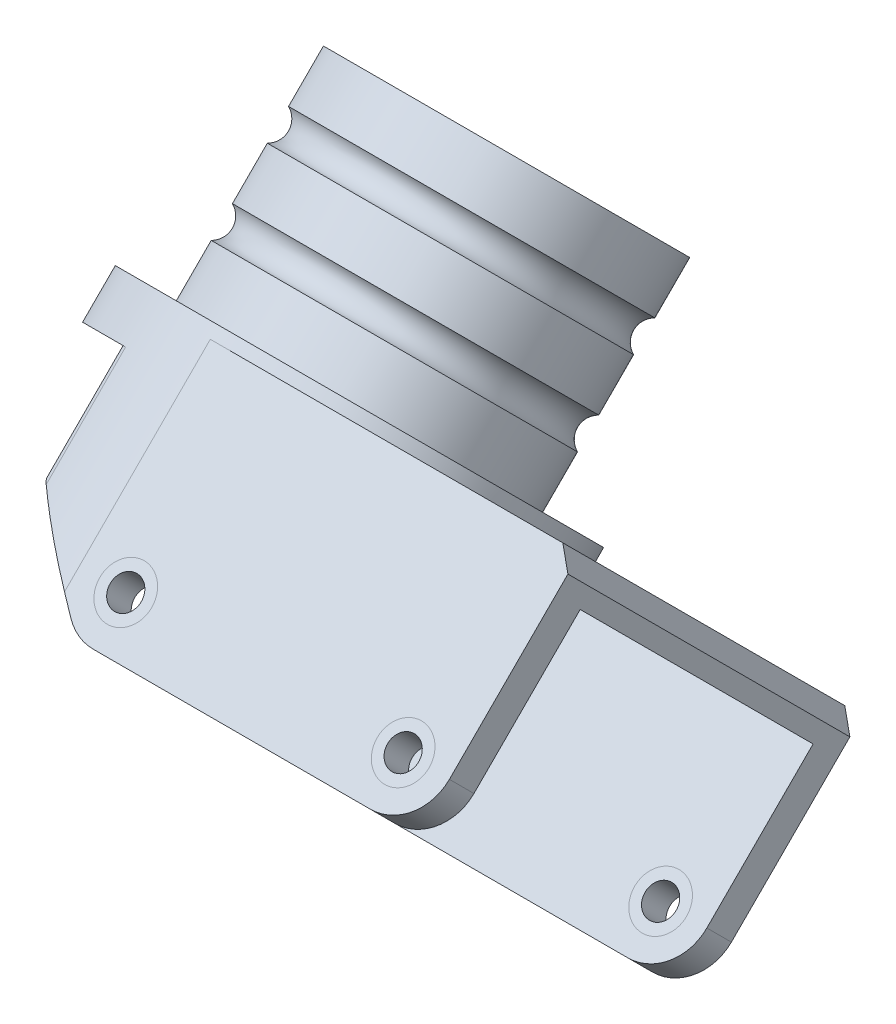
ISO-10303-21;
HEADER;
FILE_DESCRIPTION(('STEP AP214'),'2;1');
FILE_NAME('part.step','',(''),(''),'','','');
FILE_SCHEMA(('AUTOMOTIVE_DESIGN { 1 0 10303 214 1 1 1 1 }'));
ENDSEC;
DATA;
#1=APPLICATION_CONTEXT('core data for automotive mechanical design processes');
#2=APPLICATION_PROTOCOL_DEFINITION('international standard','automotive_design',2000,#1);
#3=PRODUCT_CONTEXT('',#1,'mechanical');
#4=PRODUCT('Part','Part','',(#3));
#5=PRODUCT_RELATED_PRODUCT_CATEGORY('part','',(#4));
#6=PRODUCT_DEFINITION_FORMATION('','',#4);
#7=PRODUCT_DEFINITION_CONTEXT('part definition',#1,'design');
#8=PRODUCT_DEFINITION('design','',#6,#7);
#9=PRODUCT_DEFINITION_SHAPE('','',#8);
#10=(LENGTH_UNIT() NAMED_UNIT(*) SI_UNIT(.MILLI.,.METRE.));
#11=(NAMED_UNIT(*) PLANE_ANGLE_UNIT() SI_UNIT($,.RADIAN.));
#12=(NAMED_UNIT(*) SI_UNIT($,.STERADIAN.) SOLID_ANGLE_UNIT());
#13=UNCERTAINTY_MEASURE_WITH_UNIT(LENGTH_MEASURE(1.E-05),#10,'distance_accuracy_value','');
#14=(GEOMETRIC_REPRESENTATION_CONTEXT(3) GLOBAL_UNCERTAINTY_ASSIGNED_CONTEXT((#13)) GLOBAL_UNIT_ASSIGNED_CONTEXT((#10,
#11,#12)) REPRESENTATION_CONTEXT('',''));
#15=CARTESIAN_POINT('',(0.,0.,0.));
#16=DIRECTION('',(0.,0.,1.));
#17=DIRECTION('',(1.,0.,0.));
#18=AXIS2_PLACEMENT_3D('',#15,#16,#17);
#19=CARTESIAN_POINT('',(4.,41.7193000900055,287.438906552332));
#20=DIRECTION('',(0.,-0.707106781186548,-0.707106781186547));
#21=DIRECTION('',(0.,0.707106781186547,-0.707106781186548));
#22=AXIS2_PLACEMENT_3D('',#19,#20,#21);
#23=PLANE('',#22);
#24=CARTESIAN_POINT('',(4.,41.7193000900054,287.438906552332));
#25=DIRECTION('',(0.,-0.707106781186548,-0.707106781186547));
#26=DIRECTION('',(0.,0.707106781186547,-0.707106781186548));
#27=AXIS2_PLACEMENT_3D('',#24,#25,#26);
#28=CIRCLE('',#27,2.25);
#29=CARTESIAN_POINT('',(4.,43.3102903476752,285.847916294663));
#30=VERTEX_POINT('',#29);
#31=EDGE_CURVE('E272',#30,#30,#28,.F.);
#32=ORIENTED_EDGE('',*,*,#31,.T.);
#33=EDGE_LOOP('',(#32));
#34=FACE_BOUND('',#33,.T.);
#35=DIRECTION('',(1.,0.,0.));
#36=VECTOR('',#35,1.);
#37=CARTESIAN_POINT('',(32.,53.0330085889903,276.125198053347));
#38=LINE('',#37,#36);
#39=CARTESIAN_POINT('',(0.,53.0330085889902,276.125198053347));
#40=VERTEX_POINT('',#39);
#41=CARTESIAN_POINT('',(30.5,53.0330085889903,276.125198053347));
#42=VERTEX_POINT('',#41);
#43=EDGE_CURVE('E166',#40,#42,#38,.T.);
#44=ORIENTED_EDGE('',*,*,#43,.T.);
#45=DIRECTION('',(-0.707106781186545,0.500000000000002,-0.500000000000002));
#46=VECTOR('',#45,1.);
#47=CARTESIAN_POINT('',(25.2500000000001,56.7453191902196,272.412887452118));
#48=LINE('',#47,#46);
#49=CARTESIAN_POINT('',(32.,51.9723484172105,277.185858225127));
#50=VERTEX_POINT('',#49);
#51=EDGE_CURVE('E66',#42,#50,#48,.F.);
#52=ORIENTED_EDGE('',*,*,#51,.T.);
#53=DIRECTION('',(0.,-0.707106781186548,0.707106781186547));
#54=VECTOR('',#53,1.);
#55=CARTESIAN_POINT('',(32.,53.0330085889903,276.125198053347));
#56=LINE('',#55,#54);
#57=CARTESIAN_POINT('',(32.,41.7193000900055,287.438906552332));
#58=VERTEX_POINT('',#57);
#59=EDGE_CURVE('E186',#50,#58,#56,.T.);
#60=ORIENTED_EDGE('',*,*,#59,.T.);
#61=CARTESIAN_POINT('',(28.,41.7193000900055,287.438906552332));
#62=DIRECTION('',(0.,-0.707106781186548,-0.707106781186547));
#63=DIRECTION('',(0.,0.707106781186547,-0.707106781186548));
#64=AXIS2_PLACEMENT_3D('',#61,#62,#63);
#65=CIRCLE('',#64,3.99999999999999);
#66=CARTESIAN_POINT('',(28.,38.8908729652593,290.267333677078));
#67=VERTEX_POINT('',#66);
#68=EDGE_CURVE('E395',#58,#67,#65,.T.);
#69=ORIENTED_EDGE('',*,*,#68,.T.);
#70=DIRECTION('',(-1.,0.,0.));
#71=VECTOR('',#70,1.);
#72=CARTESIAN_POINT('',(28.,38.8908729652593,290.267333677078));
#73=LINE('',#72,#71);
#74=CARTESIAN_POINT('',(4.,38.8908729652593,290.267333677078));
#75=VERTEX_POINT('',#74);
#76=EDGE_CURVE('E398',#67,#75,#73,.T.);
#77=ORIENTED_EDGE('',*,*,#76,.T.);
#78=CARTESIAN_POINT('',(4.,41.7193000900055,287.438906552332));
#79=DIRECTION('',(0.,-0.707106781186548,-0.707106781186547));
#80=DIRECTION('',(0.,0.707106781186547,-0.707106781186548));
#81=AXIS2_PLACEMENT_3D('',#78,#79,#80);
#82=CIRCLE('',#81,3.99999999999998);
#83=CARTESIAN_POINT('',(1.39177223892787,39.5748715010368,289.583335141301));
#84=VERTEX_POINT('',#83);
#85=EDGE_CURVE('E401',#75,#84,#82,.T.);
#86=ORIENTED_EDGE('',*,*,#85,.T.);
#87=DIRECTION('',(-0.758169998515034,0.461073884183281,-0.46107388418328));
#88=VECTOR('',#87,1.);
#89=CARTESIAN_POINT('',(1.39177223892787,39.5748715010368,289.583335141301));
#90=LINE('',#89,#88);
#91=CARTESIAN_POINT('',(0.,40.4212645703455,288.736942071992));
#92=VERTEX_POINT('',#91);
#93=EDGE_CURVE('E169',#84,#92,#90,.T.);
#94=ORIENTED_EDGE('',*,*,#93,.T.);
#95=DIRECTION('',(0.,0.707106781186547,-0.707106781186547));
#96=VECTOR('',#95,1.);
#97=CARTESIAN_POINT('',(0.,26.6932809897913,302.464925652546));
#98=LINE('',#97,#96);
#99=EDGE_CURVE('E163',#92,#40,#98,.T.);
#100=ORIENTED_EDGE('',*,*,#99,.T.);
#101=EDGE_LOOP('',(#44,#52,#60,#69,#77,#86,#94,#100));
#102=FACE_BOUND('',#101,.T.);
#103=CARTESIAN_POINT('',(28.,41.7193000900054,287.438906552332));
#104=DIRECTION('',(0.,-0.707106781186548,-0.707106781186547));
#105=DIRECTION('',(0.,0.707106781186547,-0.707106781186548));
#106=AXIS2_PLACEMENT_3D('',#103,#104,#105);
#107=CIRCLE('',#106,2.25);
#108=CARTESIAN_POINT('',(28.,43.3102903476752,285.847916294663));
#109=VERTEX_POINT('',#108);
#110=EDGE_CURVE('E11',#109,#109,#107,.F.);
#111=ORIENTED_EDGE('',*,*,#110,.T.);
#112=EDGE_LOOP('',(#111));
#113=FACE_BOUND('',#112,.T.);
#114=ADVANCED_FACE('F39',(#34,#102,#113),#23,.T.);
#115=CARTESIAN_POINT('',(0.,186.852966928545,186.852966928545));
#116=DIRECTION('',(0.,0.707106781186547,0.707106781186548));
#117=DIRECTION('',(0.,-0.707106781186548,0.707106781186547));
#118=AXIS2_PLACEMENT_3D('',#115,#116,#117);
#119=PLANE('',#118);
#120=CARTESIAN_POINT('',(4.,63.9931636973816,309.712770159708));
#121=DIRECTION('',(0.,0.707106781186547,0.707106781186548));
#122=DIRECTION('',(0.,-0.707106781186548,0.707106781186547));
#123=AXIS2_PLACEMENT_3D('',#120,#121,#122);
#124=CIRCLE('',#123,2.25);
#125=CARTESIAN_POINT('',(4.,62.4021734397119,311.303760417378));
#126=VERTEX_POINT('',#125);
#127=EDGE_CURVE('E276',#126,#126,#124,.F.);
#128=ORIENTED_EDGE('',*,*,#127,.F.);
#129=EDGE_LOOP('',(#128));
#130=FACE_BOUND('',#129,.T.);
#131=DIRECTION('',(-0.758169998515034,0.46107388418328,-0.46107388418328));
#132=VECTOR('',#131,1.);
#133=CARTESIAN_POINT('',(1.39177223892787,61.848735108413,311.857198748677));
#134=LINE('',#133,#132);
#135=CARTESIAN_POINT('',(1.39177223892787,61.848735108413,311.857198748677));
#136=VERTEX_POINT('',#135);
#137=CARTESIAN_POINT('',(-5.61248608016324,66.1083082850511,307.597625572039));
#138=VERTEX_POINT('',#137);
#139=EDGE_CURVE('E187',#136,#138,#134,.T.);
#140=ORIENTED_EDGE('',*,*,#139,.T.);
#141=DIRECTION('',(0.,-0.707106781186548,0.707106781186547));
#142=VECTOR('',#141,1.);
#143=CARTESIAN_POINT('',(-5.61248608016323,73.1855518528069,300.520382004283));
#144=LINE('',#143,#142);
#145=CARTESIAN_POINT('',(-5.61248608016323,73.1855518528068,300.520382004283));
#146=VERTEX_POINT('',#145);
#147=EDGE_CURVE('E253',#138,#146,#144,.F.);
#148=ORIENTED_EDGE('',*,*,#147,.T.);
#149=DIRECTION('',(1.,0.,0.));
#150=VECTOR('',#149,1.);
#151=CARTESIAN_POINT('',(-17.2499999999995,73.1855518528068,300.520382004283));
#152=LINE('',#151,#150);
#153=CARTESIAN_POINT('',(32.,73.1855518528068,300.520382004283));
#154=VERTEX_POINT('',#153);
#155=EDGE_CURVE('E372',#146,#154,#152,.T.);
#156=ORIENTED_EDGE('',*,*,#155,.T.);
#157=DIRECTION('',(0.,-0.707106781186548,0.707106781186547));
#158=VECTOR('',#157,1.);
#159=CARTESIAN_POINT('',(32.,75.3068721963665,298.399061660724));
#160=LINE('',#159,#158);
#161=CARTESIAN_POINT('',(32.,63.9931636973817,309.712770159708));
#162=VERTEX_POINT('',#161);
#163=EDGE_CURVE('E229',#154,#162,#160,.T.);
#164=ORIENTED_EDGE('',*,*,#163,.T.);
#165=CARTESIAN_POINT('',(28.,63.9931636973817,309.712770159708));
#166=DIRECTION('',(0.,0.707106781186547,0.707106781186548));
#167=DIRECTION('',(0.,-0.707106781186548,0.707106781186547));
#168=AXIS2_PLACEMENT_3D('',#165,#166,#167);
#169=CIRCLE('',#168,3.99999999999999);
#170=CARTESIAN_POINT('',(28.,61.1647365726355,312.541197284455));
#171=VERTEX_POINT('',#170);
#172=EDGE_CURVE('E386',#162,#171,#169,.F.);
#173=ORIENTED_EDGE('',*,*,#172,.T.);
#174=DIRECTION('',(-1.,0.,0.));
#175=VECTOR('',#174,1.);
#176=CARTESIAN_POINT('',(28.,61.1647365726355,312.541197284455));
#177=LINE('',#176,#175);
#178=CARTESIAN_POINT('',(4.,61.1647365726355,312.541197284455));
#179=VERTEX_POINT('',#178);
#180=EDGE_CURVE('E388',#171,#179,#177,.T.);
#181=ORIENTED_EDGE('',*,*,#180,.T.);
#182=CARTESIAN_POINT('',(4.,63.9931636973817,309.712770159708));
#183=DIRECTION('',(0.,0.707106781186547,0.707106781186548));
#184=DIRECTION('',(0.,-0.707106781186548,0.707106781186547));
#185=AXIS2_PLACEMENT_3D('',#182,#183,#184);
#186=CIRCLE('',#185,3.99999999999998);
#187=EDGE_CURVE('E390',#179,#136,#186,.F.);
#188=ORIENTED_EDGE('',*,*,#187,.T.);
#189=EDGE_LOOP('',(#140,#148,#156,#164,#173,#181,#188));
#190=FACE_BOUND('',#189,.T.);
#191=CARTESIAN_POINT('',(28.,63.9931636973816,309.712770159708));
#192=DIRECTION('',(0.,0.707106781186547,0.707106781186548));
#193=DIRECTION('',(0.,-0.707106781186548,0.707106781186547));
#194=AXIS2_PLACEMENT_3D('',#191,#192,#193);
#195=CIRCLE('',#194,2.25);
#196=CARTESIAN_POINT('',(28.,62.4021734397119,311.303760417378));
#197=VERTEX_POINT('',#196);
#198=EDGE_CURVE('E50',#197,#197,#195,.F.);
#199=ORIENTED_EDGE('',*,*,#198,.F.);
#200=EDGE_LOOP('',(#199));
#201=FACE_BOUND('',#200,.T.);
#202=ADVANCED_FACE('F320',(#130,#190,#201),#119,.F.);
#203=CARTESIAN_POINT('',(0.,166.700423664728,166.700423664729));
#204=DIRECTION('',(0.,0.707106781186547,0.707106781186548));
#205=DIRECTION('',(0.,-0.707106781186548,0.707106781186547));
#206=AXIS2_PLACEMENT_3D('',#203,#204,#205);
#207=PLANE('',#206);
#208=CARTESIAN_POINT('',(4.,43.840620433565,289.560226895892));
#209=DIRECTION('',(0.,0.707106781186547,0.707106781186548));
#210=DIRECTION('',(0.,-0.707106781186548,0.707106781186547));
#211=AXIS2_PLACEMENT_3D('',#208,#209,#210);
#212=CIRCLE('',#211,2.25);
#213=CARTESIAN_POINT('',(4.,42.2496301758952,291.151217153562));
#214=VERTEX_POINT('',#213);
#215=EDGE_CURVE('E280',#214,#214,#212,.F.);
#216=ORIENTED_EDGE('',*,*,#215,.T.);
#217=EDGE_LOOP('',(#216));
#218=FACE_BOUND('',#217,.T.);
#219=DIRECTION('',(1.,0.,0.));
#220=VECTOR('',#219,1.);
#221=CARTESIAN_POINT('',(-17.2499999999995,53.0330085889902,280.367838740467));
#222=LINE('',#221,#220);
#223=CARTESIAN_POINT('',(-5.61248608015592,53.0330085889902,280.367838740467));
#224=VERTEX_POINT('',#223);
#225=CARTESIAN_POINT('',(32.,53.0330085889902,280.367838740467));
#226=VERTEX_POINT('',#225);
#227=EDGE_CURVE('E370',#224,#226,#222,.T.);
#228=ORIENTED_EDGE('',*,*,#227,.F.);
#229=DIRECTION('',(0.,0.707106781186548,-0.707106781186547));
#230=VECTOR('',#229,1.);
#231=CARTESIAN_POINT('',(-5.61248608015592,166.700423664728,166.700423664729));
#232=LINE('',#231,#230);
#233=CARTESIAN_POINT('',(-5.61248608015593,45.95576502123,287.445082308227));
#234=VERTEX_POINT('',#233);
#235=EDGE_CURVE('E247',#224,#234,#232,.F.);
#236=ORIENTED_EDGE('',*,*,#235,.T.);
#237=DIRECTION('',(-0.758169998515034,0.46107388418328,-0.46107388418328));
#238=VECTOR('',#237,1.);
#239=CARTESIAN_POINT('',(1.39177223892786,41.6961918445964,291.70465548486));
#240=LINE('',#239,#238);
#241=CARTESIAN_POINT('',(1.39177223892787,41.6961918445964,291.70465548486));
#242=VERTEX_POINT('',#241);
#243=EDGE_CURVE('E383',#242,#234,#240,.T.);
#244=ORIENTED_EDGE('',*,*,#243,.F.);
#245=CARTESIAN_POINT('',(4.,43.840620433565,289.560226895892));
#246=DIRECTION('',(0.,0.707106781186547,0.707106781186548));
#247=DIRECTION('',(0.,-0.707106781186548,0.707106781186547));
#248=AXIS2_PLACEMENT_3D('',#245,#246,#247);
#249=CIRCLE('',#248,3.99999999999998);
#250=CARTESIAN_POINT('',(4.,41.0121933088189,292.388654020638));
#251=VERTEX_POINT('',#250);
#252=EDGE_CURVE('E380',#251,#242,#249,.F.);
#253=ORIENTED_EDGE('',*,*,#252,.F.);
#254=DIRECTION('',(-1.,0.,0.));
#255=VECTOR('',#254,1.);
#256=CARTESIAN_POINT('',(28.,41.0121933088189,292.388654020638));
#257=LINE('',#256,#255);
#258=CARTESIAN_POINT('',(28.,41.0121933088189,292.388654020638));
#259=VERTEX_POINT('',#258);
#260=EDGE_CURVE('E377',#259,#251,#257,.T.);
#261=ORIENTED_EDGE('',*,*,#260,.F.);
#262=CARTESIAN_POINT('',(28.,43.840620433565,289.560226895892));
#263=DIRECTION('',(0.,0.707106781186547,0.707106781186548));
#264=DIRECTION('',(0.,-0.707106781186548,0.707106781186547));
#265=AXIS2_PLACEMENT_3D('',#262,#263,#264);
#266=CIRCLE('',#265,3.99999999999999);
#267=CARTESIAN_POINT('',(32.,43.840620433565,289.560226895892));
#268=VERTEX_POINT('',#267);
#269=EDGE_CURVE('E374',#268,#259,#266,.F.);
#270=ORIENTED_EDGE('',*,*,#269,.F.);
#271=DIRECTION('',(0.,-0.707106781186548,0.707106781186547));
#272=VECTOR('',#271,1.);
#273=CARTESIAN_POINT('',(32.,55.1543289325499,278.246518396907));
#274=LINE('',#273,#272);
#275=EDGE_CURVE('E205',#226,#268,#274,.T.);
#276=ORIENTED_EDGE('',*,*,#275,.F.);
#277=EDGE_LOOP('',(#228,#236,#244,#253,#261,#270,#276));
#278=FACE_BOUND('',#277,.T.);
#279=CARTESIAN_POINT('',(28.,43.840620433565,289.560226895892));
#280=DIRECTION('',(0.,0.707106781186547,0.707106781186548));
#281=DIRECTION('',(0.,-0.707106781186548,0.707106781186547));
#282=AXIS2_PLACEMENT_3D('',#279,#280,#281);
#283=CIRCLE('',#282,2.25);
#284=CARTESIAN_POINT('',(28.,42.2496301758952,291.151217153562));
#285=VERTEX_POINT('',#284);
#286=EDGE_CURVE('E289',#285,#285,#283,.F.);
#287=ORIENTED_EDGE('',*,*,#286,.T.);
#288=EDGE_LOOP('',(#287));
#289=FACE_BOUND('',#288,.T.);
#290=ADVANCED_FACE('F308',(#218,#278,#289),#207,.T.);
#291=CARTESIAN_POINT('',(4.,66.1144840409414,311.834090503268));
#292=DIRECTION('',(0.,-0.707106781186548,-0.707106781186547));
#293=DIRECTION('',(0.,0.707106781186547,-0.707106781186548));
#294=AXIS2_PLACEMENT_3D('',#291,#292,#293);
#295=PLANE('',#294);
#296=CARTESIAN_POINT('',(4.,66.1144840409413,311.834090503268));
#297=DIRECTION('',(0.,-0.707106781186548,-0.707106781186547));
#298=DIRECTION('',(0.,0.707106781186547,-0.707106781186548));
#299=AXIS2_PLACEMENT_3D('',#296,#297,#298);
#300=CIRCLE('',#299,2.25);
#301=CARTESIAN_POINT('',(4.,67.7054742986111,310.243100245598));
#302=VERTEX_POINT('',#301);
#303=EDGE_CURVE('E271',#302,#302,#300,.F.);
#304=ORIENTED_EDGE('',*,*,#303,.F.);
#305=EDGE_LOOP('',(#304));
#306=FACE_BOUND('',#305,.T.);
#307=DIRECTION('',(0.,-0.707106781186548,0.707106781186547));
#308=VECTOR('',#307,1.);
#309=CARTESIAN_POINT('',(32.,77.4281925399263,300.520382004283));
#310=LINE('',#309,#308);
#311=CARTESIAN_POINT('',(32.,76.3675323681464,301.581042176063));
#312=VERTEX_POINT('',#311);
#313=CARTESIAN_POINT('',(32.,66.1144840409414,311.834090503268));
#314=VERTEX_POINT('',#313);
#315=EDGE_CURVE('E406',#312,#314,#310,.T.);
#316=ORIENTED_EDGE('',*,*,#315,.F.);
#317=DIRECTION('',(0.707106781186545,-0.500000000000002,0.500000000000002));
#318=VECTOR('',#317,1.);
#319=CARTESIAN_POINT('',(30.5,77.4281925399263,300.520382004283));
#320=LINE('',#319,#318);
#321=CARTESIAN_POINT('',(30.5,77.4281925399263,300.520382004283));
#322=VERTEX_POINT('',#321);
#323=EDGE_CURVE('E269',#312,#322,#320,.F.);
#324=ORIENTED_EDGE('',*,*,#323,.T.);
#325=DIRECTION('',(1.,0.,0.));
#326=VECTOR('',#325,1.);
#327=CARTESIAN_POINT('',(32.,77.4281925399263,300.520382004283));
#328=LINE('',#327,#326);
#329=CARTESIAN_POINT('',(0.,77.4281925399262,300.520382004283));
#330=VERTEX_POINT('',#329);
#331=EDGE_CURVE('E404',#330,#322,#328,.T.);
#332=ORIENTED_EDGE('',*,*,#331,.F.);
#333=DIRECTION('',(0.,0.707106781186547,-0.707106781186547));
#334=VECTOR('',#333,1.);
#335=CARTESIAN_POINT('',(0.,51.0884649407273,326.860109603482));
#336=LINE('',#335,#334);
#337=CARTESIAN_POINT('',(0.,64.8164485212814,313.132126022928));
#338=VERTEX_POINT('',#337);
#339=EDGE_CURVE('E191',#338,#330,#336,.T.);
#340=ORIENTED_EDGE('',*,*,#339,.F.);
#341=DIRECTION('',(-0.758169998515034,0.461073884183281,-0.46107388418328));
#342=VECTOR('',#341,1.);
#343=CARTESIAN_POINT('',(1.39177223892787,63.9700554519727,313.978519092237));
#344=LINE('',#343,#342);
#345=CARTESIAN_POINT('',(1.39177223892787,63.9700554519727,313.978519092237));
#346=VERTEX_POINT('',#345);
#347=EDGE_CURVE('E417',#346,#338,#344,.T.);
#348=ORIENTED_EDGE('',*,*,#347,.F.);
#349=CARTESIAN_POINT('',(4.,66.1144840409414,311.834090503268));
#350=DIRECTION('',(0.,-0.707106781186548,-0.707106781186547));
#351=DIRECTION('',(0.,0.707106781186547,-0.707106781186548));
#352=AXIS2_PLACEMENT_3D('',#349,#350,#351);
#353=CIRCLE('',#352,3.99999999999998);
#354=CARTESIAN_POINT('',(4.,63.2860569161952,314.662517628014));
#355=VERTEX_POINT('',#354);
#356=EDGE_CURVE('E414',#355,#346,#353,.T.);
#357=ORIENTED_EDGE('',*,*,#356,.F.);
#358=DIRECTION('',(-1.,0.,0.));
#359=VECTOR('',#358,1.);
#360=CARTESIAN_POINT('',(28.,63.2860569161952,314.662517628014));
#361=LINE('',#360,#359);
#362=CARTESIAN_POINT('',(28.,63.2860569161952,314.662517628014));
#363=VERTEX_POINT('',#362);
#364=EDGE_CURVE('E411',#363,#355,#361,.T.);
#365=ORIENTED_EDGE('',*,*,#364,.F.);
#366=CARTESIAN_POINT('',(28.,66.1144840409414,311.834090503268));
#367=DIRECTION('',(0.,-0.707106781186548,-0.707106781186547));
#368=DIRECTION('',(0.,0.707106781186547,-0.707106781186548));
#369=AXIS2_PLACEMENT_3D('',#366,#367,#368);
#370=CIRCLE('',#369,3.99999999999999);
#371=EDGE_CURVE('E408',#314,#363,#370,.T.);
#372=ORIENTED_EDGE('',*,*,#371,.F.);
#373=EDGE_LOOP('',(#316,#324,#332,#340,#348,#357,#365,#372));
#374=FACE_BOUND('',#373,.T.);
#375=CARTESIAN_POINT('',(28.,66.1144840409413,311.834090503268));
#376=DIRECTION('',(0.,-0.707106781186548,-0.707106781186547));
#377=DIRECTION('',(0.,0.707106781186547,-0.707106781186548));
#378=AXIS2_PLACEMENT_3D('',#375,#376,#377);
#379=CIRCLE('',#378,2.25);
#380=CARTESIAN_POINT('',(28.,67.7054742986111,310.243100245598));
#381=VERTEX_POINT('',#380);
#382=EDGE_CURVE('E44',#381,#381,#379,.F.);
#383=ORIENTED_EDGE('',*,*,#382,.F.);
#384=EDGE_LOOP('',(#383));
#385=FACE_BOUND('',#384,.T.);
#386=ADVANCED_FACE('F305',(#306,#374,#385),#295,.F.);
#387=ORIENTED_EDGE('',*,*,#110,.F.);
#388=EDGE_LOOP('',(#387));
#389=FACE_BOUND('',#388,.T.);
#390=CARTESIAN_POINT('',(28.,41.7193000900054,287.438906552332));
#391=DIRECTION('',(0.,-0.707106781186548,-0.707106781186547));
#392=DIRECTION('',(0.,0.707106781186547,-0.707106781186548));
#393=AXIS2_PLACEMENT_3D('',#390,#391,#392);
#394=CIRCLE('',#393,1.34999999999999);
#395=CARTESIAN_POINT('',(28.,42.6738942446073,286.48431239773));
#396=VERTEX_POINT('',#395);
#397=EDGE_CURVE('E367',#396,#396,#394,.T.);
#398=ORIENTED_EDGE('',*,*,#397,.F.);
#399=EDGE_LOOP('',(#398));
#400=FACE_BOUND('',#399,.T.);
#401=ADVANCED_FACE('F307',(#389,#400),#23,.T.);
#402=ORIENTED_EDGE('',*,*,#198,.T.);
#403=EDGE_LOOP('',(#402));
#404=FACE_BOUND('',#403,.T.);
#405=CARTESIAN_POINT('',(28.,63.9931636973816,309.712770159708));
#406=DIRECTION('',(0.,0.707106781186547,0.707106781186548));
#407=DIRECTION('',(0.,-0.707106781186548,0.707106781186547));
#408=AXIS2_PLACEMENT_3D('',#405,#406,#407);
#409=CIRCLE('',#408,1.34999999999999);
#410=CARTESIAN_POINT('',(28.,63.0385695427798,310.66736431431));
#411=VERTEX_POINT('',#410);
#412=EDGE_CURVE('E232',#411,#411,#409,.T.);
#413=ORIENTED_EDGE('',*,*,#412,.T.);
#414=EDGE_LOOP('',(#413));
#415=FACE_BOUND('',#414,.T.);
#416=ADVANCED_FACE('F316',(#404,#415),#119,.F.);
#417=ORIENTED_EDGE('',*,*,#286,.F.);
#418=EDGE_LOOP('',(#417));
#419=FACE_BOUND('',#418,.T.);
#420=CARTESIAN_POINT('',(28.,43.840620433565,289.560226895892));
#421=DIRECTION('',(0.,0.707106781186547,0.707106781186548));
#422=DIRECTION('',(0.,-0.707106781186548,0.707106781186547));
#423=AXIS2_PLACEMENT_3D('',#420,#421,#422);
#424=CIRCLE('',#423,1.34999999999999);
#425=CARTESIAN_POINT('',(28.,42.8860262789632,290.514821050494));
#426=VERTEX_POINT('',#425);
#427=EDGE_CURVE('E235',#426,#426,#424,.T.);
#428=ORIENTED_EDGE('',*,*,#427,.F.);
#429=EDGE_LOOP('',(#428));
#430=FACE_BOUND('',#429,.T.);
#431=ADVANCED_FACE('F323',(#419,#430),#207,.T.);
#432=ORIENTED_EDGE('',*,*,#382,.T.);
#433=EDGE_LOOP('',(#432));
#434=FACE_BOUND('',#433,.T.);
#435=CARTESIAN_POINT('',(28.,66.1144840409414,311.834090503268));
#436=DIRECTION('',(0.,0.707106781186548,0.707106781186548));
#437=DIRECTION('',(0.,-0.707106781186548,0.707106781186548));
#438=AXIS2_PLACEMENT_3D('',#435,#436,#437);
#439=CIRCLE('',#438,1.35);
#440=CARTESIAN_POINT('',(28.,65.1598898863396,312.78868465787));
#441=VERTEX_POINT('',#440);
#442=EDGE_CURVE('E236',#441,#441,#439,.T.);
#443=ORIENTED_EDGE('',*,*,#442,.F.);
#444=EDGE_LOOP('',(#443));
#445=FACE_BOUND('',#444,.T.);
#446=ADVANCED_FACE('F302',(#434,#445),#295,.F.);
#447=ORIENTED_EDGE('',*,*,#303,.T.);
#448=EDGE_LOOP('',(#447));
#449=FACE_BOUND('',#448,.T.);
#450=CARTESIAN_POINT('',(4.,66.1144840409414,311.834090503268));
#451=DIRECTION('',(0.,0.707106781186548,0.707106781186548));
#452=DIRECTION('',(0.,-0.707106781186548,0.707106781186548));
#453=AXIS2_PLACEMENT_3D('',#450,#451,#452);
#454=CIRCLE('',#453,1.35);
#455=CARTESIAN_POINT('',(4.,65.1598898863396,312.78868465787));
#456=VERTEX_POINT('',#455);
#457=EDGE_CURVE('E241',#456,#456,#454,.T.);
#458=ORIENTED_EDGE('',*,*,#457,.F.);
#459=EDGE_LOOP('',(#458));
#460=FACE_BOUND('',#459,.T.);
#461=ADVANCED_FACE('F311',(#449,#460),#295,.F.);
#462=CARTESIAN_POINT('',(1.39177223892787,63.9700554519727,313.978519092237));
#463=DIRECTION('',(-0.652056940268037,-0.536107147242175,0.536107147242175));
#464=DIRECTION('',(0.635085213869806,0.,0.772442082698724));
#465=AXIS2_PLACEMENT_3D('',#462,#463,#464);
#466=PLANE('',#465);
#467=CARTESIAN_POINT('',(0.,52.6188565458141,300.934534047461));
#468=DIRECTION('',(-0.652056940268037,-0.536107147242175,0.536107147242175));
#469=DIRECTION('',(-0.758169998515034,0.46107388418328,-0.46107388418328));
#470=AXIS2_PLACEMENT_3D('',#467,#468,#469);
#471=ELLIPSE('',#470,22.7521532555833,17.2499999999994);
#472=CARTESIAN_POINT('',(-5.95786983894242,67.6890494367249,308.758283018195));
#473=VERTEX_POINT('',#472);
#474=EDGE_CURVE('E461',#338,#473,#471,.T.);
#475=ORIENTED_EDGE('',*,*,#474,.T.);
#476=CARTESIAN_POINT('',(-5.61248608016323,66.8154150662375,308.304732353225));
#477=DIRECTION('',(-0.652056940268037,-0.536107147242175,0.536107147242175));
#478=DIRECTION('',(-0.758169998515034,0.461073884183274,-0.461073884183286));
#479=AXIS2_PLACEMENT_3D('',#476,#477,#478);
#480=ELLIPSE('',#479,1.31896540612082,1.);
#481=EDGE_CURVE('E251',#473,#138,#480,.T.);
#482=ORIENTED_EDGE('',*,*,#481,.T.);
#483=ORIENTED_EDGE('',*,*,#139,.F.);
#484=DIRECTION('',(0.,-0.707106781186548,-0.707106781186547));
#485=VECTOR('',#484,1.);
#486=CARTESIAN_POINT('',(1.39177223892787,63.9700554519727,313.978519092237));
#487=LINE('',#486,#485);
#488=EDGE_CURVE('E199',#346,#136,#487,.T.);
#489=ORIENTED_EDGE('',*,*,#488,.F.);
#490=ORIENTED_EDGE('',*,*,#347,.T.);
#491=EDGE_LOOP('',(#475,#482,#483,#489,#490));
#492=FACE_BOUND('',#491,.T.);
#493=ADVANCED_FACE('F330',(#492),#466,.T.);
#494=CARTESIAN_POINT('',(-17.2499999999995,73.1855518528068,300.520382004283));
#495=DIRECTION('',(0.,0.707106781186547,-0.707106781186548));
#496=DIRECTION('',(0.,0.707106781186548,0.707106781186547));
#497=AXIS2_PLACEMENT_3D('',#494,#495,#496);
#498=PLANE('',#497);
#499=CARTESIAN_POINT('',(4.94999999999968,63.1092802208994,290.444110372376));
#500=DIRECTION('',(0.,0.707106781186547,-0.707106781186548));
#501=DIRECTION('',(0.,0.707106781186548,0.707106781186547));
#502=AXIS2_PLACEMENT_3D('',#499,#500,#501);
#503=CIRCLE('',#502,6.5);
#504=CARTESIAN_POINT('',(4.94999999999968,67.7054742986119,295.040304450088));
#505=VERTEX_POINT('',#504);
#506=EDGE_CURVE('E260',#505,#505,#503,.T.);
#507=ORIENTED_EDGE('',*,*,#506,.T.);
#508=EDGE_LOOP('',(#507));
#509=FACE_BOUND('',#508,.T.);
#510=CARTESIAN_POINT('',(0.,63.1092802208993,290.444110372376));
#511=DIRECTION('',(0.,0.707106781186547,-0.707106781186548));
#512=DIRECTION('',(0.,0.707106781186548,0.707106781186547));
#513=AXIS2_PLACEMENT_3D('',#510,#511,#512);
#514=CIRCLE('',#513,17.2499999999994);
#515=CARTESIAN_POINT('',(-5.95786983893472,51.6623092900746,278.997139441551));
#516=VERTEX_POINT('',#515);
#517=CARTESIAN_POINT('',(-5.95786983894244,74.5562511517219,301.891081303198));
#518=VERTEX_POINT('',#517);
#519=EDGE_CURVE('E456',#516,#518,#514,.T.);
#520=ORIENTED_EDGE('',*,*,#519,.F.);
#521=CARTESIAN_POINT('',(-5.61248608015592,52.3259018078035,279.66073195928));
#522=DIRECTION('',(0.,0.707106781186547,-0.707106781186548));
#523=DIRECTION('',(0.,0.707106781186548,0.707106781186547));
#524=AXIS2_PLACEMENT_3D('',#521,#522,#523);
#525=CIRCLE('',#524,1.);
#526=EDGE_CURVE('E255',#516,#224,#525,.T.);
#527=ORIENTED_EDGE('',*,*,#526,.T.);
#528=ORIENTED_EDGE('',*,*,#227,.T.);
#529=DIRECTION('',(0.,0.707106781186548,0.707106781186547));
#530=VECTOR('',#529,1.);
#531=CARTESIAN_POINT('',(32.,75.3068721963666,302.641702347843));
#532=LINE('',#531,#530);
#533=EDGE_CURVE('E226',#226,#154,#532,.T.);
#534=ORIENTED_EDGE('',*,*,#533,.T.);
#535=ORIENTED_EDGE('',*,*,#155,.F.);
#536=CARTESIAN_POINT('',(-5.61248608016323,73.8926586339932,301.22748878547));
#537=DIRECTION('',(0.,0.707106781186547,-0.707106781186548));
#538=DIRECTION('',(0.,0.707106781186548,0.707106781186547));
#539=AXIS2_PLACEMENT_3D('',#536,#537,#538);
#540=CIRCLE('',#539,1.);
#541=EDGE_CURVE('E257',#146,#518,#540,.T.);
#542=ORIENTED_EDGE('',*,*,#541,.T.);
#543=EDGE_LOOP('',(#520,#527,#528,#534,#535,#542));
#544=FACE_BOUND('',#543,.T.);
#545=ADVANCED_FACE('F476',(#509,#544),#498,.F.);
#546=ORIENTED_EDGE('',*,*,#127,.T.);
#547=EDGE_LOOP('',(#546));
#548=FACE_BOUND('',#547,.T.);
#549=CARTESIAN_POINT('',(4.,63.9931636973816,309.712770159708));
#550=DIRECTION('',(0.,0.707106781186547,0.707106781186548));
#551=DIRECTION('',(0.,-0.707106781186548,0.707106781186547));
#552=AXIS2_PLACEMENT_3D('',#549,#550,#551);
#553=CIRCLE('',#552,1.34999999999999);
#554=CARTESIAN_POINT('',(4.,63.0385695427798,310.66736431431));
#555=VERTEX_POINT('',#554);
#556=EDGE_CURVE('E237',#555,#555,#553,.T.);
#557=ORIENTED_EDGE('',*,*,#556,.T.);
#558=EDGE_LOOP('',(#557));
#559=FACE_BOUND('',#558,.T.);
#560=ADVANCED_FACE('F339',(#548,#559),#119,.F.);
#561=ORIENTED_EDGE('',*,*,#243,.T.);
#562=CARTESIAN_POINT('',(-5.61248608015592,45.2486582400433,286.73797552704));
#563=DIRECTION('',(-0.652056940268037,-0.536107147242175,0.536107147242175));
#564=DIRECTION('',(-0.758169998515034,0.461073884183274,-0.461073884183286));
#565=AXIS2_PLACEMENT_3D('',#562,#563,#564);
#566=ELLIPSE('',#565,1.31896540612082,1.);
#567=CARTESIAN_POINT('',(-5.9578698389348,44.7951075750728,285.864341156553));
#568=VERTEX_POINT('',#567);
#569=EDGE_CURVE('E249',#234,#568,#566,.T.);
#570=ORIENTED_EDGE('',*,*,#569,.T.);
#571=CARTESIAN_POINT('',(0.,52.6188565458141,300.934534047461));
#572=DIRECTION('',(-0.652056940268037,-0.536107147242175,0.536107147242175));
#573=DIRECTION('',(-0.758169998515034,0.46107388418328,-0.46107388418328));
#574=AXIS2_PLACEMENT_3D('',#571,#572,#573);
#575=ELLIPSE('',#574,22.7521532555835,17.2499999999995);
#576=EDGE_CURVE('E174',#92,#568,#575,.F.);
#577=ORIENTED_EDGE('',*,*,#576,.F.);
#578=ORIENTED_EDGE('',*,*,#93,.F.);
#579=EDGE_CURVE('E423',#242,#84,#487,.T.);
#580=ORIENTED_EDGE('',*,*,#579,.F.);
#581=EDGE_LOOP('',(#561,#570,#577,#578,#580));
#582=FACE_BOUND('',#581,.T.);
#583=ADVANCED_FACE('F452',(#582),#466,.T.);
#584=CARTESIAN_POINT('',(4.,66.1144840409414,311.834090503268));
#585=DIRECTION('',(0.,-0.707106781186548,-0.707106781186547));
#586=DIRECTION('',(0.,0.707106781186547,-0.707106781186548));
#587=AXIS2_PLACEMENT_3D('',#584,#585,#586);
#588=CYLINDRICAL_SURFACE('',#587,3.99999999999998);
#589=DIRECTION('',(0.,-0.707106781186548,-0.707106781186547));
#590=VECTOR('',#589,1.);
#591=CARTESIAN_POINT('',(4.,63.2860569161952,314.662517628014));
#592=LINE('',#591,#590);
#593=EDGE_CURVE('E427',#251,#75,#592,.T.);
#594=ORIENTED_EDGE('',*,*,#593,.F.);
#595=ORIENTED_EDGE('',*,*,#252,.T.);
#596=ORIENTED_EDGE('',*,*,#579,.T.);
#597=ORIENTED_EDGE('',*,*,#85,.F.);
#598=EDGE_LOOP('',(#594,#595,#596,#597));
#599=FACE_BOUND('',#598,.T.);
#600=ADVANCED_FACE('F449',(#599),#588,.T.);
#601=CARTESIAN_POINT('',(28.,63.2860569161952,314.662517628014));
#602=DIRECTION('',(0.,-0.707106781186547,0.707106781186548));
#603=DIRECTION('',(0.,-0.707106781186548,-0.707106781186547));
#604=AXIS2_PLACEMENT_3D('',#601,#602,#603);
#605=PLANE('',#604);
#606=DIRECTION('',(0.,-0.707106781186548,-0.707106781186547));
#607=VECTOR('',#606,1.);
#608=CARTESIAN_POINT('',(28.,63.2860569161952,314.662517628014));
#609=LINE('',#608,#607);
#610=EDGE_CURVE('E430',#259,#67,#609,.T.);
#611=ORIENTED_EDGE('',*,*,#610,.F.);
#612=ORIENTED_EDGE('',*,*,#260,.T.);
#613=ORIENTED_EDGE('',*,*,#593,.T.);
#614=ORIENTED_EDGE('',*,*,#76,.F.);
#615=EDGE_LOOP('',(#611,#612,#613,#614));
#616=FACE_BOUND('',#615,.T.);
#617=ADVANCED_FACE('F446',(#616),#605,.T.);
#618=CARTESIAN_POINT('',(28.,66.1144840409414,311.834090503268));
#619=DIRECTION('',(0.,-0.707106781186548,-0.707106781186547));
#620=DIRECTION('',(0.,0.707106781186547,-0.707106781186548));
#621=AXIS2_PLACEMENT_3D('',#618,#619,#620);
#622=CYLINDRICAL_SURFACE('',#621,3.99999999999999);
#623=DIRECTION('',(0.,-0.707106781186548,-0.707106781186547));
#624=VECTOR('',#623,1.);
#625=CARTESIAN_POINT('',(32.,66.1144840409414,311.834090503268));
#626=LINE('',#625,#624);
#627=EDGE_CURVE('E420',#268,#58,#626,.T.);
#628=ORIENTED_EDGE('',*,*,#627,.F.);
#629=ORIENTED_EDGE('',*,*,#269,.T.);
#630=ORIENTED_EDGE('',*,*,#610,.T.);
#631=ORIENTED_EDGE('',*,*,#68,.F.);
#632=EDGE_LOOP('',(#628,#629,#630,#631));
#633=FACE_BOUND('',#632,.T.);
#634=ADVANCED_FACE('F441',(#633),#622,.T.);
#635=CARTESIAN_POINT('',(0.,69.5085965906377,265.730728369906));
#636=DIRECTION('',(0.,0.707106781186544,-0.707106781186552));
#637=DIRECTION('',(0.,0.707106781186552,0.707106781186544));
#638=AXIS2_PLACEMENT_3D('',#635,#636,#637);
#639=PLANE('',#638);
#640=CARTESIAN_POINT('',(0.,78.6656294070034,274.887761186271));
#641=DIRECTION('',(0.,-0.707106781186544,0.707106781186552));
#642=DIRECTION('',(0.,-0.707106781186552,-0.707106781186544));
#643=AXIS2_PLACEMENT_3D('',#640,#641,#642);
#644=CIRCLE('',#643,10.9499999999997);
#645=CARTESIAN_POINT('',(0.,70.9228101530108,267.144941932279));
#646=VERTEX_POINT('',#645);
#647=EDGE_CURVE('E206',#646,#646,#644,.T.);
#648=ORIENTED_EDGE('',*,*,#647,.T.);
#649=EDGE_LOOP('',(#648));
#650=FACE_BOUND('',#649,.T.);
#651=CARTESIAN_POINT('',(0.,78.6656294070033,274.887761186271));
#652=DIRECTION('',(0.,-0.707106781186544,0.707106781186552));
#653=DIRECTION('',(0.,-0.707106781186552,-0.707106781186544));
#654=AXIS2_PLACEMENT_3D('',#651,#652,#653);
#655=CIRCLE('',#654,12.9499999999997);
#656=CARTESIAN_POINT('',(0.,69.5085965906377,265.730728369906));
#657=VERTEX_POINT('',#656);
#658=EDGE_CURVE('E192',#657,#657,#655,.T.);
#659=ORIENTED_EDGE('',*,*,#658,.F.);
#660=EDGE_LOOP('',(#659));
#661=FACE_BOUND('',#660,.T.);
#662=ADVANCED_FACE('F526',(#650,#661),#639,.T.);
#663=CARTESIAN_POINT('',(0.,37.8861923635659,315.667198229709));
#664=DIRECTION('',(0.,-0.707106781186544,0.707106781186552));
#665=DIRECTION('',(0.,-0.707106781186552,-0.707106781186544));
#666=AXIS2_PLACEMENT_3D('',#663,#664,#665);
#667=CYLINDRICAL_SURFACE('',#666,10.9499999999997);
#668=CARTESIAN_POINT('',(0.,65.9377073456455,287.615683247629));
#669=DIRECTION('',(0.,0.707106781186544,-0.707106781186551));
#670=DIRECTION('',(0.,0.707106781186551,0.707106781186544));
#671=AXIS2_PLACEMENT_3D('',#668,#669,#670);
#672=CIRCLE('',#671,10.9499999999997);
#673=CARTESIAN_POINT('',(10.9499999999997,65.9377073456457,287.61568324763));
#674=VERTEX_POINT('',#673);
#675=EDGE_CURVE('E203',#674,#674,#672,.T.);
#676=ORIENTED_EDGE('',*,*,#675,.F.);
#677=EDGE_LOOP('',(#676));
#678=FACE_BOUND('',#677,.T.);
#679=ORIENTED_EDGE('',*,*,#647,.F.);
#680=EDGE_LOOP('',(#679));
#681=FACE_BOUND('',#680,.T.);
#682=ADVANCED_FACE('F522',(#678,#681),#667,.F.);
#683=CARTESIAN_POINT('',(0.,55.3311056278474,277.009081529831));
#684=DIRECTION('',(0.,0.707106781186544,-0.707106781186552));
#685=DIRECTION('',(0.,0.707106781186552,0.707106781186544));
#686=AXIS2_PLACEMENT_3D('',#683,#684,#685);
#687=PLANE('',#686);
#688=CARTESIAN_POINT('',(0.,65.9377073456455,287.615683247629));
#689=DIRECTION('',(0.,-0.707106781186544,0.707106781186552));
#690=DIRECTION('',(0.,-0.707106781186552,-0.707106781186544));
#691=AXIS2_PLACEMENT_3D('',#688,#689,#690);
#692=CIRCLE('',#691,12.9499999999997);
#693=CARTESIAN_POINT('',(0.,56.7806745292799,278.458650431264));
#694=VERTEX_POINT('',#693);
#695=EDGE_CURVE('E219',#694,#694,#692,.T.);
#696=ORIENTED_EDGE('',*,*,#695,.T.);
#697=EDGE_LOOP('',(#696));
#698=FACE_BOUND('',#697,.T.);
#699=CARTESIAN_POINT('',(0.,65.9377073456455,287.615683247629));
#700=DIRECTION('',(0.,0.707106781186544,-0.707106781186551));
#701=DIRECTION('',(0.,0.707106781186551,0.707106781186544));
#702=AXIS2_PLACEMENT_3D('',#699,#700,#701);
#703=CIRCLE('',#702,17.2499999999995);
#704=CARTESIAN_POINT('',(0.,78.1352993211132,299.813275223097));
#705=VERTEX_POINT('',#704);
#706=EDGE_CURVE('E193',#705,#705,#703,.T.);
#707=ORIENTED_EDGE('',*,*,#706,.T.);
#708=EDGE_LOOP('',(#707));
#709=FACE_BOUND('',#708,.T.);
#710=ADVANCED_FACE('F525',(#698,#709),#687,.T.);
#711=CARTESIAN_POINT('',(0.,37.8861923635659,315.667198229709));
#712=DIRECTION('',(0.,-0.707106781186544,0.707106781186552));
#713=DIRECTION('',(0.,-0.707106781186552,-0.707106781186544));
#714=AXIS2_PLACEMENT_3D('',#711,#712,#713);
#715=CYLINDRICAL_SURFACE('',#714,12.9499999999997);
#716=CARTESIAN_POINT('',(0.,68.9556031613732,284.597787431902));
#717=DIRECTION('',(0.,-0.707106781186544,0.707106781186552));
#718=DIRECTION('',(0.,-0.707106781186552,-0.707106781186544));
#719=AXIS2_PLACEMENT_3D('',#716,#717,#718);
#720=CIRCLE('',#719,12.9499999999997);
#721=CARTESIAN_POINT('',(0.,59.7985703450076,275.440754615536));
#722=VERTEX_POINT('',#721);
#723=EDGE_CURVE('E216',#722,#722,#720,.T.);
#724=ORIENTED_EDGE('',*,*,#723,.T.);
#725=EDGE_LOOP('',(#724));
#726=FACE_BOUND('',#725,.T.);
#727=ORIENTED_EDGE('',*,*,#695,.F.);
#728=EDGE_LOOP('',(#727));
#729=FACE_BOUND('',#728,.T.);
#730=ADVANCED_FACE('F556',(#726,#729),#715,.T.);
#731=CARTESIAN_POINT('',(0.,69.8741618149169,283.679228778358));
#732=DIRECTION('',(0.,-0.707106781186544,0.707106781186552));
#733=DIRECTION('',(0.,-0.707106781186552,-0.707106781186544));
#734=AXIS2_PLACEMENT_3D('',#731,#732,#733);
#735=TOROIDAL_SURFACE('',#734,13.6999999999997,1.49999999999999);
#736=CARTESIAN_POINT('',(0.,70.7927204684606,282.760670124814));
#737=DIRECTION('',(0.,-0.707106781186544,0.707106781186552));
#738=DIRECTION('',(0.,-0.707106781186552,-0.707106781186544));
#739=AXIS2_PLACEMENT_3D('',#736,#737,#738);
#740=CIRCLE('',#739,12.9499999999998);
#741=CARTESIAN_POINT('',(0.,61.635687652095,273.603637308449));
#742=VERTEX_POINT('',#741);
#743=EDGE_CURVE('E213',#742,#742,#740,.T.);
#744=ORIENTED_EDGE('',*,*,#743,.T.);
#745=EDGE_LOOP('',(#744));
#746=FACE_BOUND('',#745,.T.);
#747=ORIENTED_EDGE('',*,*,#723,.F.);
#748=EDGE_LOOP('',(#747));
#749=FACE_BOUND('',#748,.T.);
#750=ADVANCED_FACE('F550',(#746,#749),#735,.F.);
#751=CARTESIAN_POINT('',(0.,37.8861923635659,315.667198229709));
#752=DIRECTION('',(0.,-0.707106781186544,0.707106781186552));
#753=DIRECTION('',(0.,-0.707106781186552,-0.707106781186544));
#754=AXIS2_PLACEMENT_3D('',#751,#752,#753);
#755=CYLINDRICAL_SURFACE('',#754,12.9499999999998);
#756=CARTESIAN_POINT('',(0.,73.8106162841883,279.742774309086));
#757=DIRECTION('',(0.,-0.707106781186544,0.707106781186552));
#758=DIRECTION('',(0.,-0.707106781186552,-0.707106781186544));
#759=AXIS2_PLACEMENT_3D('',#756,#757,#758);
#760=CIRCLE('',#759,12.9499999999997);
#761=CARTESIAN_POINT('',(0.,64.6535834678226,270.585741492721));
#762=VERTEX_POINT('',#761);
#763=EDGE_CURVE('E210',#762,#762,#760,.T.);
#764=ORIENTED_EDGE('',*,*,#763,.T.);
#765=EDGE_LOOP('',(#764));
#766=FACE_BOUND('',#765,.T.);
#767=ORIENTED_EDGE('',*,*,#743,.F.);
#768=EDGE_LOOP('',(#767));
#769=FACE_BOUND('',#768,.T.);
#770=ADVANCED_FACE('F544',(#766,#769),#755,.T.);
#771=CARTESIAN_POINT('',(0.,74.729174937732,278.824215655543));
#772=DIRECTION('',(0.,-0.707106781186544,0.707106781186552));
#773=DIRECTION('',(0.,-0.707106781186552,-0.707106781186544));
#774=AXIS2_PLACEMENT_3D('',#771,#772,#773);
#775=TOROIDAL_SURFACE('',#774,13.6999999999998,1.49999999999999);
#776=CARTESIAN_POINT('',(0.,75.6477335912757,277.905657001999));
#777=DIRECTION('',(0.,-0.707106781186544,0.707106781186552));
#778=DIRECTION('',(0.,-0.707106781186552,-0.707106781186544));
#779=AXIS2_PLACEMENT_3D('',#776,#777,#778);
#780=CIRCLE('',#779,12.9499999999998);
#781=CARTESIAN_POINT('',(0.,66.49070077491,268.748624185634));
#782=VERTEX_POINT('',#781);
#783=EDGE_CURVE('E196',#782,#782,#780,.T.);
#784=ORIENTED_EDGE('',*,*,#783,.T.);
#785=EDGE_LOOP('',(#784));
#786=FACE_BOUND('',#785,.T.);
#787=ORIENTED_EDGE('',*,*,#763,.F.);
#788=EDGE_LOOP('',(#787));
#789=FACE_BOUND('',#788,.T.);
#790=ADVANCED_FACE('F538',(#786,#789),#775,.F.);
#791=CARTESIAN_POINT('',(0.,37.8861923635659,315.667198229709));
#792=DIRECTION('',(0.,-0.707106781186544,0.707106781186552));
#793=DIRECTION('',(0.,-0.707106781186552,-0.707106781186544));
#794=AXIS2_PLACEMENT_3D('',#791,#792,#793);
#795=CYLINDRICAL_SURFACE('',#794,12.9499999999998);
#796=ORIENTED_EDGE('',*,*,#658,.T.);
#797=EDGE_LOOP('',(#796));
#798=FACE_BOUND('',#797,.T.);
#799=ORIENTED_EDGE('',*,*,#783,.F.);
#800=EDGE_LOOP('',(#799));
#801=FACE_BOUND('',#800,.T.);
#802=ADVANCED_FACE('F535',(#798,#801),#795,.T.);
#803=CARTESIAN_POINT('',(0.,30.7306005644602,322.822790028815));
#804=DIRECTION('',(0.,0.707106781186544,-0.707106781186551));
#805=DIRECTION('',(0.,0.707106781186551,0.707106781186544));
#806=AXIS2_PLACEMENT_3D('',#803,#804,#805);
#807=CYLINDRICAL_SURFACE('',#806,17.2499999999995);
#808=ORIENTED_EDGE('',*,*,#706,.F.);
#809=EDGE_LOOP('',(#808));
#810=FACE_BOUND('',#809,.T.);
#811=ORIENTED_EDGE('',*,*,#576,.T.);
#812=DIRECTION('',(0.,0.707106781186544,-0.707106781186551));
#813=VECTOR('',#812,1.);
#814=CARTESIAN_POINT('',(-5.95786983893476,19.2836296336353,311.37581909799));
#815=LINE('',#814,#813);
#816=EDGE_CURVE('E244',#568,#516,#815,.T.);
#817=ORIENTED_EDGE('',*,*,#816,.T.);
#818=ORIENTED_EDGE('',*,*,#519,.T.);
#819=DIRECTION('',(0.,0.707106781186544,-0.707106781186551));
#820=VECTOR('',#819,1.);
#821=CARTESIAN_POINT('',(-5.95786983894252,42.177571495283,334.269760959638));
#822=LINE('',#821,#820);
#823=EDGE_CURVE('E231',#518,#473,#822,.F.);
#824=ORIENTED_EDGE('',*,*,#823,.T.);
#825=ORIENTED_EDGE('',*,*,#474,.F.);
#826=ORIENTED_EDGE('',*,*,#339,.T.);
#827=CARTESIAN_POINT('',(0.,65.2306005644591,288.322790028816));
#828=DIRECTION('',(0.,-0.707106781186544,0.707106781186552));
#829=DIRECTION('',(0.,-0.707106781186552,-0.707106781186544));
#830=AXIS2_PLACEMENT_3D('',#827,#828,#829);
#831=CIRCLE('',#830,17.2499999999995);
#832=EDGE_CURVE('E182',#330,#40,#831,.F.);
#833=ORIENTED_EDGE('',*,*,#832,.T.);
#834=ORIENTED_EDGE('',*,*,#99,.F.);
#835=EDGE_LOOP('',(#811,#817,#818,#824,#825,#826,#833,#834));
#836=FACE_BOUND('',#835,.T.);
#837=ADVANCED_FACE('F189',(#810,#836),#807,.T.);
#838=CARTESIAN_POINT('',(0.,65.9377073456455,287.615683247629));
#839=DIRECTION('',(0.,0.707106781186544,-0.707106781186551));
#840=DIRECTION('',(0.,0.707106781186551,0.707106781186544));
#841=AXIS2_PLACEMENT_3D('',#838,#839,#840);
#842=PLANE('',#841);
#843=ORIENTED_EDGE('',*,*,#675,.T.);
#844=CARTESIAN_POINT('',(4.94999999999968,65.9377073456456,287.61568324763));
#845=DIRECTION('',(0.,0.707106781186544,-0.707106781186551));
#846=DIRECTION('',(0.,0.707106781186551,0.707106781186544));
#847=AXIS2_PLACEMENT_3D('',#844,#845,#846);
#848=CIRCLE('',#847,6.00000000000001);
#849=EDGE_CURVE('E175',#674,#674,#848,.T.);
#850=ORIENTED_EDGE('',*,*,#849,.F.);
#851=EDGE_LOOP('',(#843,#850));
#852=FACE_BOUND('',#851,.T.);
#853=ADVANCED_FACE('F519',(#852),#842,.T.);
#854=CARTESIAN_POINT('',(32.,77.4281925399263,300.520382004283));
#855=DIRECTION('',(0.,0.707106781186547,-0.707106781186548));
#856=DIRECTION('',(0.,0.707106781186548,0.707106781186547));
#857=AXIS2_PLACEMENT_3D('',#854,#855,#856);
#858=PLANE('',#857);
#859=ORIENTED_EDGE('',*,*,#331,.T.);
#860=DIRECTION('',(0.,-0.707106781186548,-0.707106781186547));
#861=VECTOR('',#860,1.);
#862=CARTESIAN_POINT('',(30.5,77.4281925399263,300.520382004283));
#863=LINE('',#862,#861);
#864=EDGE_CURVE('E185',#322,#42,#863,.T.);
#865=ORIENTED_EDGE('',*,*,#864,.T.);
#866=ORIENTED_EDGE('',*,*,#43,.F.);
#867=ORIENTED_EDGE('',*,*,#832,.F.);
#868=EDGE_LOOP('',(#859,#865,#866,#867));
#869=FACE_BOUND('',#868,.T.);
#870=ADVANCED_FACE('F181',(#869),#858,.T.);
#871=ORIENTED_EDGE('',*,*,#187,.F.);
#872=EDGE_CURVE('E424',#355,#179,#592,.T.);
#873=ORIENTED_EDGE('',*,*,#872,.F.);
#874=ORIENTED_EDGE('',*,*,#356,.T.);
#875=ORIENTED_EDGE('',*,*,#488,.T.);
#876=EDGE_LOOP('',(#871,#873,#874,#875));
#877=FACE_BOUND('',#876,.T.);
#878=ADVANCED_FACE('F601',(#877),#588,.T.);
#879=ORIENTED_EDGE('',*,*,#180,.F.);
#880=EDGE_CURVE('E428',#363,#171,#609,.T.);
#881=ORIENTED_EDGE('',*,*,#880,.F.);
#882=ORIENTED_EDGE('',*,*,#364,.T.);
#883=ORIENTED_EDGE('',*,*,#872,.T.);
#884=EDGE_LOOP('',(#879,#881,#882,#883));
#885=FACE_BOUND('',#884,.T.);
#886=ADVANCED_FACE('F604',(#885),#605,.T.);
#887=ORIENTED_EDGE('',*,*,#172,.F.);
#888=EDGE_CURVE('E431',#314,#162,#626,.T.);
#889=ORIENTED_EDGE('',*,*,#888,.F.);
#890=ORIENTED_EDGE('',*,*,#371,.T.);
#891=ORIENTED_EDGE('',*,*,#880,.T.);
#892=EDGE_LOOP('',(#887,#889,#890,#891));
#893=FACE_BOUND('',#892,.T.);
#894=ADVANCED_FACE('F350',(#893),#622,.T.);
#895=CARTESIAN_POINT('',(32.,77.4281925399263,300.520382004283));
#896=DIRECTION('',(1.,0.,0.));
#897=DIRECTION('',(0.,0.,-1.));
#898=AXIS2_PLACEMENT_3D('',#895,#896,#897);
#899=PLANE('',#898);
#900=ORIENTED_EDGE('',*,*,#59,.F.);
#901=DIRECTION('',(0.,0.707106781186548,0.707106781186547));
#902=VECTOR('',#901,1.);
#903=CARTESIAN_POINT('',(32.,76.3675323681464,301.581042176063));
#904=LINE('',#903,#902);
#905=EDGE_CURVE('E58',#50,#312,#904,.T.);
#906=ORIENTED_EDGE('',*,*,#905,.T.);
#907=ORIENTED_EDGE('',*,*,#315,.T.);
#908=ORIENTED_EDGE('',*,*,#888,.T.);
#909=ORIENTED_EDGE('',*,*,#163,.F.);
#910=ORIENTED_EDGE('',*,*,#533,.F.);
#911=ORIENTED_EDGE('',*,*,#275,.T.);
#912=ORIENTED_EDGE('',*,*,#627,.T.);
#913=EDGE_LOOP('',(#900,#906,#907,#908,#909,#910,#911,#912));
#914=FACE_BOUND('',#913,.T.);
#915=ADVANCED_FACE('F342',(#914),#899,.T.);
#916=ORIENTED_EDGE('',*,*,#31,.F.);
#917=EDGE_LOOP('',(#916));
#918=FACE_BOUND('',#917,.T.);
#919=CARTESIAN_POINT('',(4.,41.7193000900054,287.438906552332));
#920=DIRECTION('',(0.,-0.707106781186548,-0.707106781186547));
#921=DIRECTION('',(0.,0.707106781186547,-0.707106781186548));
#922=AXIS2_PLACEMENT_3D('',#919,#920,#921);
#923=CIRCLE('',#922,1.34999999999999);
#924=CARTESIAN_POINT('',(4.,42.6738942446073,286.48431239773));
#925=VERTEX_POINT('',#924);
#926=EDGE_CURVE('E356',#925,#925,#923,.T.);
#927=ORIENTED_EDGE('',*,*,#926,.F.);
#928=EDGE_LOOP('',(#927));
#929=FACE_BOUND('',#928,.T.);
#930=ADVANCED_FACE('F319',(#918,#929),#23,.T.);
#931=ORIENTED_EDGE('',*,*,#215,.F.);
#932=EDGE_LOOP('',(#931));
#933=FACE_BOUND('',#932,.T.);
#934=CARTESIAN_POINT('',(4.,43.840620433565,289.560226895892));
#935=DIRECTION('',(0.,0.707106781186547,0.707106781186548));
#936=DIRECTION('',(0.,-0.707106781186548,0.707106781186547));
#937=AXIS2_PLACEMENT_3D('',#934,#935,#936);
#938=CIRCLE('',#937,1.34999999999999);
#939=CARTESIAN_POINT('',(4.,42.8860262789632,290.514821050494));
#940=VERTEX_POINT('',#939);
#941=EDGE_CURVE('E240',#940,#940,#938,.T.);
#942=ORIENTED_EDGE('',*,*,#941,.F.);
#943=EDGE_LOOP('',(#942));
#944=FACE_BOUND('',#943,.T.);
#945=ADVANCED_FACE('F324',(#933,#944),#207,.T.);
#946=CARTESIAN_POINT('',(28.,66.1144840409414,311.834090503268));
#947=DIRECTION('',(0.,0.707106781186548,0.707106781186548));
#948=DIRECTION('',(0.,-0.707106781186548,0.707106781186548));
#949=AXIS2_PLACEMENT_3D('',#946,#947,#948);
#950=CYLINDRICAL_SURFACE('',#949,1.34999999999999);
#951=ORIENTED_EDGE('',*,*,#442,.T.);
#952=EDGE_LOOP('',(#951));
#953=FACE_BOUND('',#952,.T.);
#954=ORIENTED_EDGE('',*,*,#412,.F.);
#955=EDGE_LOOP('',(#954));
#956=FACE_BOUND('',#955,.T.);
#957=ADVANCED_FACE('F348',(#953,#956),#950,.F.);
#958=ORIENTED_EDGE('',*,*,#397,.T.);
#959=EDGE_LOOP('',(#958));
#960=FACE_BOUND('',#959,.T.);
#961=ORIENTED_EDGE('',*,*,#427,.T.);
#962=EDGE_LOOP('',(#961));
#963=FACE_BOUND('',#962,.T.);
#964=ADVANCED_FACE('F471',(#960,#963),#950,.F.);
#965=CARTESIAN_POINT('',(4.,66.1144840409414,311.834090503268));
#966=DIRECTION('',(0.,0.707106781186548,0.707106781186548));
#967=DIRECTION('',(0.,-0.707106781186548,0.707106781186548));
#968=AXIS2_PLACEMENT_3D('',#965,#966,#967);
#969=CYLINDRICAL_SURFACE('',#968,1.34999999999999);
#970=ORIENTED_EDGE('',*,*,#457,.T.);
#971=EDGE_LOOP('',(#970));
#972=FACE_BOUND('',#971,.T.);
#973=ORIENTED_EDGE('',*,*,#556,.F.);
#974=EDGE_LOOP('',(#973));
#975=FACE_BOUND('',#974,.T.);
#976=ADVANCED_FACE('F466',(#972,#975),#969,.F.);
#977=ORIENTED_EDGE('',*,*,#926,.T.);
#978=EDGE_LOOP('',(#977));
#979=FACE_BOUND('',#978,.T.);
#980=ORIENTED_EDGE('',*,*,#941,.T.);
#981=EDGE_LOOP('',(#980));
#982=FACE_BOUND('',#981,.T.);
#983=ADVANCED_FACE('F470',(#979,#982),#969,.F.);
#984=CARTESIAN_POINT('',(-5.61248608015592,19.9472221513644,312.039411615719));
#985=DIRECTION('',(0.,0.707106781186544,-0.707106781186551));
#986=DIRECTION('',(0.,0.707106781186551,0.707106781186544));
#987=AXIS2_PLACEMENT_3D('',#984,#985,#986);
#988=CYLINDRICAL_SURFACE('',#987,1.);
#989=ORIENTED_EDGE('',*,*,#569,.F.);
#990=ORIENTED_EDGE('',*,*,#235,.F.);
#991=ORIENTED_EDGE('',*,*,#526,.F.);
#992=ORIENTED_EDGE('',*,*,#816,.F.);
#993=EDGE_LOOP('',(#989,#990,#991,#992));
#994=FACE_BOUND('',#993,.T.);
#995=ADVANCED_FACE('F502',(#994),#988,.T.);
#996=CARTESIAN_POINT('',(-5.61248608016323,41.5139789775541,333.606168441909));
#997=DIRECTION('',(0.,0.707106781186544,-0.707106781186551));
#998=DIRECTION('',(0.,0.707106781186551,0.707106781186544));
#999=AXIS2_PLACEMENT_3D('',#996,#997,#998);
#1000=CYLINDRICAL_SURFACE('',#999,1.);
#1001=ORIENTED_EDGE('',*,*,#541,.F.);
#1002=ORIENTED_EDGE('',*,*,#147,.F.);
#1003=ORIENTED_EDGE('',*,*,#481,.F.);
#1004=ORIENTED_EDGE('',*,*,#823,.F.);
#1005=EDGE_LOOP('',(#1001,#1002,#1003,#1004));
#1006=FACE_BOUND('',#1005,.T.);
#1007=ADVANCED_FACE('F506',(#1006),#1000,.T.);
#1008=CARTESIAN_POINT('',(4.94999999999968,38.8908729652602,314.662517628015));
#1009=DIRECTION('',(0.,0.707106781186544,-0.707106781186551));
#1010=DIRECTION('',(0.,0.707106781186551,0.707106781186544));
#1011=AXIS2_PLACEMENT_3D('',#1008,#1009,#1010);
#1012=CYLINDRICAL_SURFACE('',#1011,6.00000000000001);
#1013=CARTESIAN_POINT('',(4.94999999999968,63.4628336114927,290.090556981782));
#1014=DIRECTION('',(0.,0.707106781186548,-0.707106781186548));
#1015=DIRECTION('',(0.,0.707106781186548,0.707106781186548));
#1016=AXIS2_PLACEMENT_3D('',#1013,#1014,#1015);
#1017=CIRCLE('',#1016,6.00000000000001);
#1018=CARTESIAN_POINT('',(4.94999999999968,67.705474298612,294.333197668902));
#1019=VERTEX_POINT('',#1018);
#1020=EDGE_CURVE('E263',#1019,#1019,#1017,.F.);
#1021=ORIENTED_EDGE('',*,*,#1020,.T.);
#1022=EDGE_LOOP('',(#1021));
#1023=FACE_BOUND('',#1022,.T.);
#1024=ORIENTED_EDGE('',*,*,#849,.T.);
#1025=EDGE_LOOP('',(#1024));
#1026=FACE_BOUND('',#1025,.T.);
#1027=ADVANCED_FACE('F503',(#1023,#1026),#1012,.F.);
#1028=CARTESIAN_POINT('',(4.94999999999968,63.1092802208994,290.444110372376));
#1029=DIRECTION('',(0.,-0.707106781186548,0.707106781186548));
#1030=DIRECTION('',(0.,-0.707106781186548,-0.707106781186548));
#1031=AXIS2_PLACEMENT_3D('',#1028,#1029,#1030);
#1032=CONICAL_SURFACE('',#1031,6.50000000000001,0.785398163397433);
#1033=ORIENTED_EDGE('',*,*,#1020,.F.);
#1034=EDGE_LOOP('',(#1033));
#1035=FACE_BOUND('',#1034,.T.);
#1036=ORIENTED_EDGE('',*,*,#506,.F.);
#1037=EDGE_LOOP('',(#1036));
#1038=FACE_BOUND('',#1037,.T.);
#1039=ADVANCED_FACE('F505',(#1035,#1038),#1032,.F.);
#1040=CARTESIAN_POINT('',(30.5,77.4281925399263,300.520382004283));
#1041=DIRECTION('',(-0.70710678118655,-0.499999999999998,0.499999999999998));
#1042=DIRECTION('',(0.,-0.707106781186548,-0.707106781186547));
#1043=AXIS2_PLACEMENT_3D('',#1040,#1041,#1042);
#1044=PLANE('',#1043);
#1045=ORIENTED_EDGE('',*,*,#323,.F.);
#1046=ORIENTED_EDGE('',*,*,#905,.F.);
#1047=ORIENTED_EDGE('',*,*,#51,.F.);
#1048=ORIENTED_EDGE('',*,*,#864,.F.);
#1049=EDGE_LOOP('',(#1045,#1046,#1047,#1048));
#1050=FACE_BOUND('',#1049,.T.);
#1051=ADVANCED_FACE('F42',(#1050),#1044,.F.);
#1052=CLOSED_SHELL('',(#114,#202,#290,#386,#401,#416,#431,#446,#461,#493,#545,#560,#583,#600,
#617,#634,#662,#682,#710,#730,#750,#770,#790,#802,#837,#853,#870,#878,#886,#894,#915,#930,#945,
#957,#964,#976,#983,#995,#1007,#1027,#1039,#1051));
#1053=MANIFOLD_SOLID_BREP('B2',#1052);
#1054=ADVANCED_BREP_SHAPE_REPRESENTATION('',(#18,#1053),#14);
#1055=SHAPE_DEFINITION_REPRESENTATION(#9,#1054);
ENDSEC;
END-ISO-10303-21;
